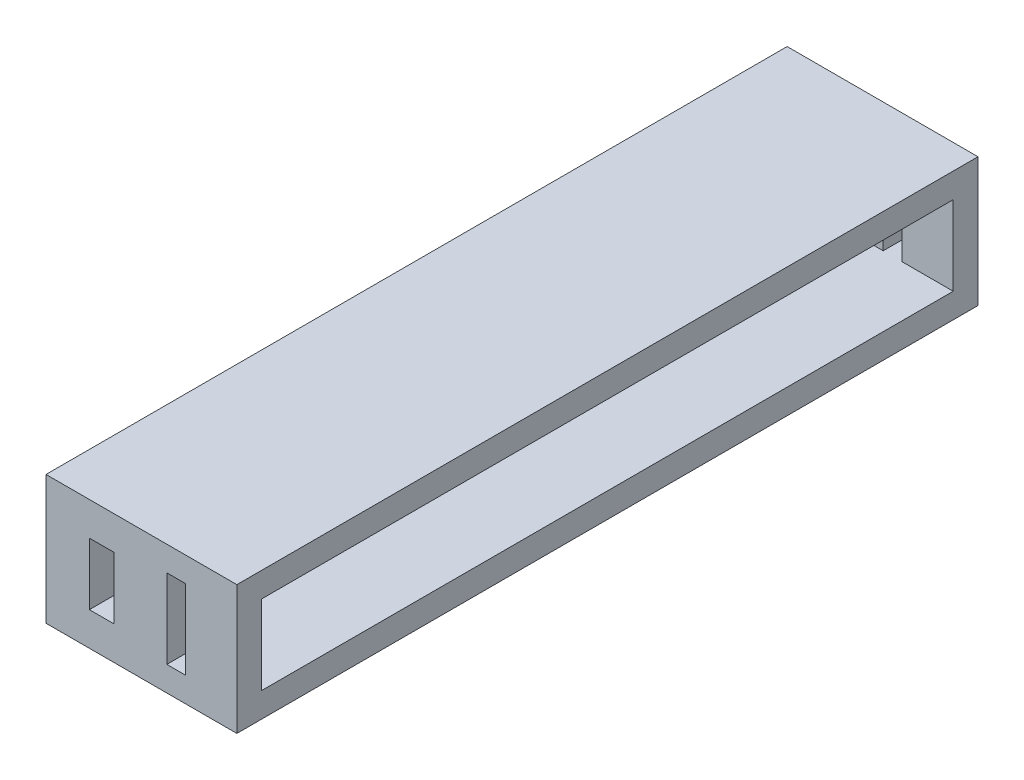
ISO-10303-21;
HEADER;
FILE_DESCRIPTION(('STEP AP214'),'2;1');
FILE_NAME('part.step','',(''),(''),'','','');
FILE_SCHEMA(('AUTOMOTIVE_DESIGN { 1 0 10303 214 1 1 1 1 }'));
ENDSEC;
DATA;
#1=APPLICATION_CONTEXT('core data for automotive mechanical design processes');
#2=APPLICATION_PROTOCOL_DEFINITION('international standard','automotive_design',2000,#1);
#3=PRODUCT_CONTEXT('',#1,'mechanical');
#4=PRODUCT('Part','Part','',(#3));
#5=PRODUCT_RELATED_PRODUCT_CATEGORY('part','',(#4));
#6=PRODUCT_DEFINITION_FORMATION('','',#4);
#7=PRODUCT_DEFINITION_CONTEXT('part definition',#1,'design');
#8=PRODUCT_DEFINITION('design','',#6,#7);
#9=PRODUCT_DEFINITION_SHAPE('','',#8);
#10=(LENGTH_UNIT() NAMED_UNIT(*) SI_UNIT(.MILLI.,.METRE.));
#11=(NAMED_UNIT(*) PLANE_ANGLE_UNIT() SI_UNIT($,.RADIAN.));
#12=(NAMED_UNIT(*) SI_UNIT($,.STERADIAN.) SOLID_ANGLE_UNIT());
#13=UNCERTAINTY_MEASURE_WITH_UNIT(LENGTH_MEASURE(1.E-05),#10,'distance_accuracy_value','');
#14=(GEOMETRIC_REPRESENTATION_CONTEXT(3) GLOBAL_UNCERTAINTY_ASSIGNED_CONTEXT((#13)) GLOBAL_UNIT_ASSIGNED_CONTEXT((#10,
#11,#12)) REPRESENTATION_CONTEXT('',''));
#15=CARTESIAN_POINT('',(0.,0.,0.));
#16=DIRECTION('',(0.,0.,1.));
#17=DIRECTION('',(1.,0.,0.));
#18=AXIS2_PLACEMENT_3D('',#15,#16,#17);
#19=CARTESIAN_POINT('',(13.4,0.,-115.6));
#20=DIRECTION('',(0.,0.,1.));
#21=DIRECTION('',(1.,0.,0.));
#22=AXIS2_PLACEMENT_3D('',#19,#20,#21);
#23=PLANE('',#22);
#24=DIRECTION('',(0.,1.,0.));
#25=VECTOR('',#24,1.);
#26=CARTESIAN_POINT('',(-6.4,1.4,-115.6));
#27=LINE('',#26,#25);
#28=CARTESIAN_POINT('',(-6.4,1.4,-115.6));
#29=VERTEX_POINT('',#28);
#30=CARTESIAN_POINT('',(-6.4,11.4,-115.6));
#31=VERTEX_POINT('',#30);
#32=EDGE_CURVE('E70',#29,#31,#27,.T.);
#33=ORIENTED_EDGE('',*,*,#32,.T.);
#34=DIRECTION('',(-1.,0.,0.));
#35=VECTOR('',#34,1.);
#36=CARTESIAN_POINT('',(-10.4,11.4,-115.6));
#37=LINE('',#36,#35);
#38=CARTESIAN_POINT('',(-10.4,11.4,-115.6));
#39=VERTEX_POINT('',#38);
#40=EDGE_CURVE('E420',#31,#39,#37,.T.);
#41=ORIENTED_EDGE('',*,*,#40,.T.);
#42=DIRECTION('',(0.,-1.,0.));
#43=VECTOR('',#42,1.);
#44=CARTESIAN_POINT('',(-10.4,1.4,-115.6));
#45=LINE('',#44,#43);
#46=CARTESIAN_POINT('',(-10.4,1.4,-115.6));
#47=VERTEX_POINT('',#46);
#48=EDGE_CURVE('E413',#39,#47,#45,.T.);
#49=ORIENTED_EDGE('',*,*,#48,.T.);
#50=DIRECTION('',(1.,0.,0.));
#51=VECTOR('',#50,1.);
#52=CARTESIAN_POINT('',(-10.4,1.4,-115.6));
#53=LINE('',#52,#51);
#54=EDGE_CURVE('E414',#47,#29,#53,.T.);
#55=ORIENTED_EDGE('',*,*,#54,.T.);
#56=EDGE_LOOP('',(#33,#41,#49,#55));
#57=FACE_BOUND('',#56,.T.);
#58=DIRECTION('',(0.,1.,0.));
#59=VECTOR('',#58,1.);
#60=CARTESIAN_POINT('',(-17.4,0.,-115.6));
#61=LINE('',#60,#59);
#62=CARTESIAN_POINT('',(-17.4,-4.,-115.6));
#63=VERTEX_POINT('',#62);
#64=CARTESIAN_POINT('',(-17.4,16.8,-115.6));
#65=VERTEX_POINT('',#64);
#66=EDGE_CURVE('E251',#63,#65,#61,.T.);
#67=ORIENTED_EDGE('',*,*,#66,.T.);
#68=DIRECTION('',(-1.,0.,0.));
#69=VECTOR('',#68,1.);
#70=CARTESIAN_POINT('',(13.4,16.8,-115.6));
#71=LINE('',#70,#69);
#72=CARTESIAN_POINT('',(13.4,16.8,-115.6));
#73=VERTEX_POINT('',#72);
#74=EDGE_CURVE('E255',#73,#65,#71,.T.);
#75=ORIENTED_EDGE('',*,*,#74,.F.);
#76=DIRECTION('',(0.,1.,0.));
#77=VECTOR('',#76,1.);
#78=CARTESIAN_POINT('',(13.4,0.,-115.6));
#79=LINE('',#78,#77);
#80=CARTESIAN_POINT('',(13.4,-4.,-115.6));
#81=VERTEX_POINT('',#80);
#82=EDGE_CURVE('E267',#81,#73,#79,.T.);
#83=ORIENTED_EDGE('',*,*,#82,.F.);
#84=DIRECTION('',(-1.,0.,0.));
#85=VECTOR('',#84,1.);
#86=CARTESIAN_POINT('',(13.4,-4.,-115.6));
#87=LINE('',#86,#85);
#88=EDGE_CURVE('E55',#81,#63,#87,.T.);
#89=ORIENTED_EDGE('',*,*,#88,.T.);
#90=EDGE_LOOP('',(#67,#75,#83,#89));
#91=FACE_BOUND('',#90,.T.);
#92=DIRECTION('',(0.,-1.,0.));
#93=VECTOR('',#92,1.);
#94=CARTESIAN_POINT('',(2.1,12.8,-115.6));
#95=LINE('',#94,#93);
#96=CARTESIAN_POINT('',(2.1,12.8,-115.6));
#97=VERTEX_POINT('',#96);
#98=CARTESIAN_POINT('',(2.1,0.,-115.6));
#99=VERTEX_POINT('',#98);
#100=EDGE_CURVE('E58',#97,#99,#95,.T.);
#101=ORIENTED_EDGE('',*,*,#100,.T.);
#102=DIRECTION('',(1.,0.,0.));
#103=VECTOR('',#102,1.);
#104=CARTESIAN_POINT('',(2.1,0.,-115.6));
#105=LINE('',#104,#103);
#106=CARTESIAN_POINT('',(5.1,0.,-115.6));
#107=VERTEX_POINT('',#106);
#108=EDGE_CURVE('E211',#99,#107,#105,.T.);
#109=ORIENTED_EDGE('',*,*,#108,.T.);
#110=DIRECTION('',(0.,1.,0.));
#111=VECTOR('',#110,1.);
#112=CARTESIAN_POINT('',(5.1,12.8,-115.6));
#113=LINE('',#112,#111);
#114=CARTESIAN_POINT('',(5.1,12.8,-115.6));
#115=VERTEX_POINT('',#114);
#116=EDGE_CURVE('E525',#107,#115,#113,.T.);
#117=ORIENTED_EDGE('',*,*,#116,.T.);
#118=DIRECTION('',(-1.,0.,0.));
#119=VECTOR('',#118,1.);
#120=CARTESIAN_POINT('',(2.1,12.8,-115.6));
#121=LINE('',#120,#119);
#122=EDGE_CURVE('E397',#115,#97,#121,.T.);
#123=ORIENTED_EDGE('',*,*,#122,.T.);
#124=EDGE_LOOP('',(#101,#109,#117,#123));
#125=FACE_BOUND('',#124,.T.);
#126=ADVANCED_FACE('F43',(#57,#91,#125),#23,.F.);
#127=CARTESIAN_POINT('',(13.4,0.,-111.6));
#128=DIRECTION('',(0.,0.,1.));
#129=DIRECTION('',(1.,0.,0.));
#130=AXIS2_PLACEMENT_3D('',#127,#128,#129);
#131=PLANE('',#130);
#132=DIRECTION('',(0.,-1.,0.));
#133=VECTOR('',#132,1.);
#134=CARTESIAN_POINT('',(2.1,12.8,-111.6));
#135=LINE('',#134,#133);
#136=CARTESIAN_POINT('',(2.1,12.8,-111.6));
#137=VERTEX_POINT('',#136);
#138=CARTESIAN_POINT('',(2.1,0.,-111.6));
#139=VERTEX_POINT('',#138);
#140=EDGE_CURVE('E210',#137,#139,#135,.T.);
#141=ORIENTED_EDGE('',*,*,#140,.F.);
#142=DIRECTION('',(-1.,0.,0.));
#143=VECTOR('',#142,1.);
#144=CARTESIAN_POINT('',(13.4,12.8,-111.6));
#145=LINE('',#144,#143);
#146=CARTESIAN_POINT('',(-13.4,12.8,-111.6));
#147=VERTEX_POINT('',#146);
#148=EDGE_CURVE('E218',#137,#147,#145,.T.);
#149=ORIENTED_EDGE('',*,*,#148,.T.);
#150=DIRECTION('',(0.,1.,0.));
#151=VECTOR('',#150,1.);
#152=CARTESIAN_POINT('',(-13.4,0.,-111.6));
#153=LINE('',#152,#151);
#154=CARTESIAN_POINT('',(-13.4,0.,-111.6));
#155=VERTEX_POINT('',#154);
#156=EDGE_CURVE('E515',#155,#147,#153,.T.);
#157=ORIENTED_EDGE('',*,*,#156,.F.);
#158=DIRECTION('',(-1.,0.,0.));
#159=VECTOR('',#158,1.);
#160=CARTESIAN_POINT('',(13.4,0.,-111.6));
#161=LINE('',#160,#159);
#162=EDGE_CURVE('E224',#139,#155,#161,.T.);
#163=ORIENTED_EDGE('',*,*,#162,.F.);
#164=EDGE_LOOP('',(#141,#149,#157,#163));
#165=FACE_BOUND('',#164,.T.);
#166=DIRECTION('',(-1.,0.,0.));
#167=VECTOR('',#166,1.);
#168=CARTESIAN_POINT('',(-10.4,11.4,-111.6));
#169=LINE('',#168,#167);
#170=CARTESIAN_POINT('',(-6.4,11.4,-111.6));
#171=VERTEX_POINT('',#170);
#172=CARTESIAN_POINT('',(-10.4,11.4,-111.6));
#173=VERTEX_POINT('',#172);
#174=EDGE_CURVE('E403',#171,#173,#169,.T.);
#175=ORIENTED_EDGE('',*,*,#174,.F.);
#176=DIRECTION('',(0.,1.,0.));
#177=VECTOR('',#176,1.);
#178=CARTESIAN_POINT('',(-6.4,1.4,-111.6));
#179=LINE('',#178,#177);
#180=CARTESIAN_POINT('',(-6.4,1.4,-111.6));
#181=VERTEX_POINT('',#180);
#182=EDGE_CURVE('E409',#181,#171,#179,.T.);
#183=ORIENTED_EDGE('',*,*,#182,.F.);
#184=DIRECTION('',(1.,0.,0.));
#185=VECTOR('',#184,1.);
#186=CARTESIAN_POINT('',(-10.4,1.4,-111.6));
#187=LINE('',#186,#185);
#188=CARTESIAN_POINT('',(-10.4,1.4,-111.6));
#189=VERTEX_POINT('',#188);
#190=EDGE_CURVE('E389',#189,#181,#187,.T.);
#191=ORIENTED_EDGE('',*,*,#190,.F.);
#192=DIRECTION('',(0.,-1.,0.));
#193=VECTOR('',#192,1.);
#194=CARTESIAN_POINT('',(-10.4,1.4,-111.6));
#195=LINE('',#194,#193);
#196=EDGE_CURVE('E401',#173,#189,#195,.T.);
#197=ORIENTED_EDGE('',*,*,#196,.F.);
#198=EDGE_LOOP('',(#175,#183,#191,#197));
#199=FACE_BOUND('',#198,.T.);
#200=ADVANCED_FACE('F219',(#165,#199),#131,.T.);
#201=DIRECTION('',(0.,1.,0.));
#202=VECTOR('',#201,1.);
#203=CARTESIAN_POINT('',(5.1,12.8,-111.6));
#204=LINE('',#203,#202);
#205=CARTESIAN_POINT('',(5.1,0.,-111.6));
#206=VERTEX_POINT('',#205);
#207=CARTESIAN_POINT('',(5.1,12.8,-111.6));
#208=VERTEX_POINT('',#207);
#209=EDGE_CURVE('E225',#206,#208,#204,.T.);
#210=ORIENTED_EDGE('',*,*,#209,.F.);
#211=CARTESIAN_POINT('',(13.4,0.,-111.6));
#212=VERTEX_POINT('',#211);
#213=EDGE_CURVE('E238',#212,#206,#161,.T.);
#214=ORIENTED_EDGE('',*,*,#213,.F.);
#215=DIRECTION('',(0.,1.,0.));
#216=VECTOR('',#215,1.);
#217=CARTESIAN_POINT('',(13.4,0.,-111.6));
#218=LINE('',#217,#216);
#219=CARTESIAN_POINT('',(13.4,12.8,-111.6));
#220=VERTEX_POINT('',#219);
#221=EDGE_CURVE('E394',#212,#220,#218,.T.);
#222=ORIENTED_EDGE('',*,*,#221,.T.);
#223=EDGE_CURVE('E230',#220,#208,#145,.T.);
#224=ORIENTED_EDGE('',*,*,#223,.T.);
#225=EDGE_LOOP('',(#210,#214,#222,#224));
#226=FACE_BOUND('',#225,.T.);
#227=ADVANCED_FACE('F308',(#226),#131,.T.);
#228=CARTESIAN_POINT('',(13.4,0.,0.));
#229=DIRECTION('',(0.,0.,-1.));
#230=DIRECTION('',(-1.,0.,0.));
#231=AXIS2_PLACEMENT_3D('',#228,#229,#230);
#232=PLANE('',#231);
#233=DIRECTION('',(0.,1.,0.));
#234=VECTOR('',#233,1.);
#235=CARTESIAN_POINT('',(-6.4,1.4,0.));
#236=LINE('',#235,#234);
#237=CARTESIAN_POINT('',(-6.4,1.4,0.));
#238=VERTEX_POINT('',#237);
#239=CARTESIAN_POINT('',(-6.4,11.4,0.));
#240=VERTEX_POINT('',#239);
#241=EDGE_CURVE('E451',#238,#240,#236,.T.);
#242=ORIENTED_EDGE('',*,*,#241,.T.);
#243=DIRECTION('',(-1.,0.,0.));
#244=VECTOR('',#243,1.);
#245=CARTESIAN_POINT('',(-10.4,11.4,0.));
#246=LINE('',#245,#244);
#247=CARTESIAN_POINT('',(-10.4,11.4,0.));
#248=VERTEX_POINT('',#247);
#249=EDGE_CURVE('E472',#240,#248,#246,.T.);
#250=ORIENTED_EDGE('',*,*,#249,.T.);
#251=DIRECTION('',(0.,-1.,0.));
#252=VECTOR('',#251,1.);
#253=CARTESIAN_POINT('',(-10.4,1.4,0.));
#254=LINE('',#253,#252);
#255=CARTESIAN_POINT('',(-10.4,1.4,0.));
#256=VERTEX_POINT('',#255);
#257=EDGE_CURVE('E473',#248,#256,#254,.T.);
#258=ORIENTED_EDGE('',*,*,#257,.T.);
#259=DIRECTION('',(1.,0.,0.));
#260=VECTOR('',#259,1.);
#261=CARTESIAN_POINT('',(-10.4,1.4,0.));
#262=LINE('',#261,#260);
#263=EDGE_CURVE('E466',#256,#238,#262,.T.);
#264=ORIENTED_EDGE('',*,*,#263,.T.);
#265=EDGE_LOOP('',(#242,#250,#258,#264));
#266=FACE_BOUND('',#265,.T.);
#267=DIRECTION('',(-1.,0.,0.));
#268=VECTOR('',#267,1.);
#269=CARTESIAN_POINT('',(13.4,12.8,0.));
#270=LINE('',#269,#268);
#271=CARTESIAN_POINT('',(2.1,12.8,0.));
#272=VERTEX_POINT('',#271);
#273=CARTESIAN_POINT('',(-13.4,12.8,0.));
#274=VERTEX_POINT('',#273);
#275=EDGE_CURVE('E234',#272,#274,#270,.T.);
#276=ORIENTED_EDGE('',*,*,#275,.F.);
#277=DIRECTION('',(0.,-1.,0.));
#278=VECTOR('',#277,1.);
#279=CARTESIAN_POINT('',(2.1,12.8,0.));
#280=LINE('',#279,#278);
#281=CARTESIAN_POINT('',(2.1,0.,0.));
#282=VERTEX_POINT('',#281);
#283=EDGE_CURVE('E448',#272,#282,#280,.T.);
#284=ORIENTED_EDGE('',*,*,#283,.T.);
#285=DIRECTION('',(-1.,0.,0.));
#286=VECTOR('',#285,1.);
#287=CARTESIAN_POINT('',(13.4,0.,0.));
#288=LINE('',#287,#286);
#289=CARTESIAN_POINT('',(-13.4,0.,0.));
#290=VERTEX_POINT('',#289);
#291=EDGE_CURVE('E241',#282,#290,#288,.T.);
#292=ORIENTED_EDGE('',*,*,#291,.T.);
#293=DIRECTION('',(0.,-1.,0.));
#294=VECTOR('',#293,1.);
#295=CARTESIAN_POINT('',(-13.4,0.,0.));
#296=LINE('',#295,#294);
#297=EDGE_CURVE('E499',#274,#290,#296,.T.);
#298=ORIENTED_EDGE('',*,*,#297,.F.);
#299=EDGE_LOOP('',(#276,#284,#292,#298));
#300=FACE_BOUND('',#299,.T.);
#301=ADVANCED_FACE('F316',(#266,#300),#232,.T.);
#302=CARTESIAN_POINT('',(13.4,0.,0.));
#303=VERTEX_POINT('',#302);
#304=CARTESIAN_POINT('',(5.1,0.,0.));
#305=VERTEX_POINT('',#304);
#306=EDGE_CURVE('E245',#303,#305,#288,.T.);
#307=ORIENTED_EDGE('',*,*,#306,.T.);
#308=DIRECTION('',(0.,1.,0.));
#309=VECTOR('',#308,1.);
#310=CARTESIAN_POINT('',(5.1,12.8,0.));
#311=LINE('',#310,#309);
#312=CARTESIAN_POINT('',(5.1,12.8,0.));
#313=VERTEX_POINT('',#312);
#314=EDGE_CURVE('E453',#305,#313,#311,.T.);
#315=ORIENTED_EDGE('',*,*,#314,.T.);
#316=CARTESIAN_POINT('',(13.4,12.8,0.));
#317=VERTEX_POINT('',#316);
#318=EDGE_CURVE('E229',#317,#313,#270,.T.);
#319=ORIENTED_EDGE('',*,*,#318,.F.);
#320=DIRECTION('',(0.,-1.,0.));
#321=VECTOR('',#320,1.);
#322=CARTESIAN_POINT('',(13.4,0.,0.));
#323=LINE('',#322,#321);
#324=EDGE_CURVE('E501',#317,#303,#323,.T.);
#325=ORIENTED_EDGE('',*,*,#324,.T.);
#326=EDGE_LOOP('',(#307,#315,#319,#325));
#327=FACE_BOUND('',#326,.T.);
#328=ADVANCED_FACE('F319',(#327),#232,.T.);
#329=CARTESIAN_POINT('',(13.4,0.,0.));
#330=DIRECTION('',(-1.,0.,0.));
#331=DIRECTION('',(0.,0.,1.));
#332=AXIS2_PLACEMENT_3D('',#329,#330,#331);
#333=PLANE('',#332);
#334=DIRECTION('',(0.,-1.,0.));
#335=VECTOR('',#334,1.);
#336=CARTESIAN_POINT('',(13.4,0.,4.));
#337=LINE('',#336,#335);
#338=CARTESIAN_POINT('',(13.4,16.8,4.));
#339=VERTEX_POINT('',#338);
#340=CARTESIAN_POINT('',(13.4,-4.,4.));
#341=VERTEX_POINT('',#340);
#342=EDGE_CURVE('E264',#339,#341,#337,.T.);
#343=ORIENTED_EDGE('',*,*,#342,.T.);
#344=DIRECTION('',(0.,0.,-1.));
#345=VECTOR('',#344,1.);
#346=CARTESIAN_POINT('',(13.4,-4.,0.));
#347=LINE('',#346,#345);
#348=EDGE_CURVE('E263',#341,#81,#347,.T.);
#349=ORIENTED_EDGE('',*,*,#348,.T.);
#350=ORIENTED_EDGE('',*,*,#82,.T.);
#351=DIRECTION('',(0.,0.,1.));
#352=VECTOR('',#351,1.);
#353=CARTESIAN_POINT('',(13.4,16.8,0.));
#354=LINE('',#353,#352);
#355=EDGE_CURVE('E50',#73,#339,#354,.T.);
#356=ORIENTED_EDGE('',*,*,#355,.T.);
#357=EDGE_LOOP('',(#343,#349,#350,#356));
#358=FACE_BOUND('',#357,.T.);
#359=ORIENTED_EDGE('',*,*,#324,.F.);
#360=DIRECTION('',(0.,0.,1.));
#361=VECTOR('',#360,1.);
#362=CARTESIAN_POINT('',(13.4,12.8,0.));
#363=LINE('',#362,#361);
#364=EDGE_CURVE('E391',#220,#317,#363,.T.);
#365=ORIENTED_EDGE('',*,*,#364,.F.);
#366=ORIENTED_EDGE('',*,*,#221,.F.);
#367=DIRECTION('',(0.,0.,-1.));
#368=VECTOR('',#367,1.);
#369=CARTESIAN_POINT('',(13.4,0.,0.));
#370=LINE('',#369,#368);
#371=EDGE_CURVE('E503',#303,#212,#370,.T.);
#372=ORIENTED_EDGE('',*,*,#371,.F.);
#373=EDGE_LOOP('',(#359,#365,#366,#372));
#374=FACE_BOUND('',#373,.T.);
#375=ADVANCED_FACE('F275',(#358,#374),#333,.F.);
#376=CARTESIAN_POINT('',(13.4,0.,4.));
#377=DIRECTION('',(0.,0.,-1.));
#378=DIRECTION('',(-1.,0.,0.));
#379=AXIS2_PLACEMENT_3D('',#376,#377,#378);
#380=PLANE('',#379);
#381=DIRECTION('',(1.,0.,0.));
#382=VECTOR('',#381,1.);
#383=CARTESIAN_POINT('',(2.1,0.,4.));
#384=LINE('',#383,#382);
#385=CARTESIAN_POINT('',(2.1,0.,4.));
#386=VERTEX_POINT('',#385);
#387=CARTESIAN_POINT('',(5.1,0.,4.));
#388=VERTEX_POINT('',#387);
#389=EDGE_CURVE('E443',#386,#388,#384,.T.);
#390=ORIENTED_EDGE('',*,*,#389,.F.);
#391=DIRECTION('',(0.,-1.,0.));
#392=VECTOR('',#391,1.);
#393=CARTESIAN_POINT('',(2.1,12.8,4.));
#394=LINE('',#393,#392);
#395=CARTESIAN_POINT('',(2.1,12.8,4.));
#396=VERTEX_POINT('',#395);
#397=EDGE_CURVE('E450',#396,#386,#394,.T.);
#398=ORIENTED_EDGE('',*,*,#397,.F.);
#399=DIRECTION('',(-1.,0.,0.));
#400=VECTOR('',#399,1.);
#401=CARTESIAN_POINT('',(2.1,12.8,4.));
#402=LINE('',#401,#400);
#403=CARTESIAN_POINT('',(5.1,12.8,4.));
#404=VERTEX_POINT('',#403);
#405=EDGE_CURVE('E440',#404,#396,#402,.T.);
#406=ORIENTED_EDGE('',*,*,#405,.F.);
#407=DIRECTION('',(0.,1.,0.));
#408=VECTOR('',#407,1.);
#409=CARTESIAN_POINT('',(5.1,12.8,4.));
#410=LINE('',#409,#408);
#411=EDGE_CURVE('E441',#388,#404,#410,.T.);
#412=ORIENTED_EDGE('',*,*,#411,.F.);
#413=EDGE_LOOP('',(#390,#398,#406,#412));
#414=FACE_BOUND('',#413,.T.);
#415=DIRECTION('',(-1.,0.,0.));
#416=VECTOR('',#415,1.);
#417=CARTESIAN_POINT('',(-10.4,11.4,4.));
#418=LINE('',#417,#416);
#419=CARTESIAN_POINT('',(-6.4,11.4,4.));
#420=VERTEX_POINT('',#419);
#421=CARTESIAN_POINT('',(-10.4,11.4,4.));
#422=VERTEX_POINT('',#421);
#423=EDGE_CURVE('E483',#420,#422,#418,.T.);
#424=ORIENTED_EDGE('',*,*,#423,.F.);
#425=DIRECTION('',(0.,1.,0.));
#426=VECTOR('',#425,1.);
#427=CARTESIAN_POINT('',(-6.4,1.4,4.));
#428=LINE('',#427,#426);
#429=CARTESIAN_POINT('',(-6.4,1.4,4.));
#430=VERTEX_POINT('',#429);
#431=EDGE_CURVE('E475',#430,#420,#428,.T.);
#432=ORIENTED_EDGE('',*,*,#431,.F.);
#433=DIRECTION('',(1.,0.,0.));
#434=VECTOR('',#433,1.);
#435=CARTESIAN_POINT('',(-10.4,1.4,4.));
#436=LINE('',#435,#434);
#437=CARTESIAN_POINT('',(-10.4,1.4,4.));
#438=VERTEX_POINT('',#437);
#439=EDGE_CURVE('E433',#438,#430,#436,.T.);
#440=ORIENTED_EDGE('',*,*,#439,.F.);
#441=DIRECTION('',(0.,-1.,0.));
#442=VECTOR('',#441,1.);
#443=CARTESIAN_POINT('',(-10.4,1.4,4.));
#444=LINE('',#443,#442);
#445=EDGE_CURVE('E486',#422,#438,#444,.T.);
#446=ORIENTED_EDGE('',*,*,#445,.F.);
#447=EDGE_LOOP('',(#424,#432,#440,#446));
#448=FACE_BOUND('',#447,.T.);
#449=DIRECTION('',(0.,-1.,0.));
#450=VECTOR('',#449,1.);
#451=CARTESIAN_POINT('',(-17.4,0.,4.));
#452=LINE('',#451,#450);
#453=CARTESIAN_POINT('',(-17.4,16.8,4.));
#454=VERTEX_POINT('',#453);
#455=CARTESIAN_POINT('',(-17.4,-4.,4.));
#456=VERTEX_POINT('',#455);
#457=EDGE_CURVE('E244',#454,#456,#452,.T.);
#458=ORIENTED_EDGE('',*,*,#457,.T.);
#459=DIRECTION('',(-1.,0.,0.));
#460=VECTOR('',#459,1.);
#461=CARTESIAN_POINT('',(13.4,-4.,4.));
#462=LINE('',#461,#460);
#463=EDGE_CURVE('E12',#341,#456,#462,.T.);
#464=ORIENTED_EDGE('',*,*,#463,.F.);
#465=ORIENTED_EDGE('',*,*,#342,.F.);
#466=DIRECTION('',(-1.,0.,0.));
#467=VECTOR('',#466,1.);
#468=CARTESIAN_POINT('',(13.4,16.8,4.));
#469=LINE('',#468,#467);
#470=EDGE_CURVE('E248',#339,#454,#469,.T.);
#471=ORIENTED_EDGE('',*,*,#470,.T.);
#472=EDGE_LOOP('',(#458,#464,#465,#471));
#473=FACE_BOUND('',#472,.T.);
#474=ADVANCED_FACE('F282',(#414,#448,#473),#380,.F.);
#475=CARTESIAN_POINT('',(13.4,-4.,0.));
#476=DIRECTION('',(0.,1.,0.));
#477=DIRECTION('',(0.,0.,1.));
#478=AXIS2_PLACEMENT_3D('',#475,#476,#477);
#479=PLANE('',#478);
#480=DIRECTION('',(0.,0.,-1.));
#481=VECTOR('',#480,1.);
#482=CARTESIAN_POINT('',(-17.4,-4.,0.));
#483=LINE('',#482,#481);
#484=EDGE_CURVE('E250',#456,#63,#483,.T.);
#485=ORIENTED_EDGE('',*,*,#484,.T.);
#486=ORIENTED_EDGE('',*,*,#88,.F.);
#487=ORIENTED_EDGE('',*,*,#348,.F.);
#488=ORIENTED_EDGE('',*,*,#463,.T.);
#489=EDGE_LOOP('',(#485,#486,#487,#488));
#490=FACE_BOUND('',#489,.T.);
#491=ADVANCED_FACE('F285',(#490),#479,.F.);
#492=CARTESIAN_POINT('',(13.4,16.8,0.));
#493=DIRECTION('',(0.,-1.,0.));
#494=DIRECTION('',(0.,0.,-1.));
#495=AXIS2_PLACEMENT_3D('',#492,#493,#494);
#496=PLANE('',#495);
#497=DIRECTION('',(0.,0.,1.));
#498=VECTOR('',#497,1.);
#499=CARTESIAN_POINT('',(-17.4,16.8,0.));
#500=LINE('',#499,#498);
#501=EDGE_CURVE('E259',#65,#454,#500,.T.);
#502=ORIENTED_EDGE('',*,*,#501,.T.);
#503=ORIENTED_EDGE('',*,*,#470,.F.);
#504=ORIENTED_EDGE('',*,*,#355,.F.);
#505=ORIENTED_EDGE('',*,*,#74,.T.);
#506=EDGE_LOOP('',(#502,#503,#504,#505));
#507=FACE_BOUND('',#506,.T.);
#508=ADVANCED_FACE('F280',(#507),#496,.F.);
#509=CARTESIAN_POINT('',(-17.4,0.,0.));
#510=DIRECTION('',(-1.,0.,0.));
#511=DIRECTION('',(0.,0.,1.));
#512=AXIS2_PLACEMENT_3D('',#509,#510,#511);
#513=PLANE('',#512);
#514=CARTESIAN_POINT('',(-17.4,6.4,-105.8));
#515=DIRECTION('',(1.,0.,0.));
#516=DIRECTION('',(0.,0.,-1.));
#517=AXIS2_PLACEMENT_3D('',#514,#515,#516);
#518=CIRCLE('',#517,2.5);
#519=CARTESIAN_POINT('',(-17.4,6.4,-103.3));
#520=VERTEX_POINT('',#519);
#521=EDGE_CURVE('E431',#520,#520,#518,.T.);
#522=ORIENTED_EDGE('',*,*,#521,.T.);
#523=EDGE_LOOP('',(#522));
#524=FACE_BOUND('',#523,.T.);
#525=CARTESIAN_POINT('',(-17.4,6.4,-5.8));
#526=DIRECTION('',(-1.,0.,0.));
#527=DIRECTION('',(0.,0.,1.));
#528=AXIS2_PLACEMENT_3D('',#525,#526,#527);
#529=CIRCLE('',#528,2.5);
#530=CARTESIAN_POINT('',(-17.4,6.4,-3.3));
#531=VERTEX_POINT('',#530);
#532=EDGE_CURVE('E439',#531,#531,#529,.T.);
#533=ORIENTED_EDGE('',*,*,#532,.F.);
#534=EDGE_LOOP('',(#533));
#535=FACE_BOUND('',#534,.T.);
#536=ORIENTED_EDGE('',*,*,#457,.F.);
#537=ORIENTED_EDGE('',*,*,#501,.F.);
#538=ORIENTED_EDGE('',*,*,#66,.F.);
#539=ORIENTED_EDGE('',*,*,#484,.F.);
#540=EDGE_LOOP('',(#536,#537,#538,#539));
#541=FACE_BOUND('',#540,.T.);
#542=ADVANCED_FACE('F44',(#524,#535,#541),#513,.T.);
#543=CARTESIAN_POINT('',(13.4,0.,0.));
#544=DIRECTION('',(0.,1.,0.));
#545=DIRECTION('',(0.,0.,1.));
#546=AXIS2_PLACEMENT_3D('',#543,#544,#545);
#547=PLANE('',#546);
#548=DIRECTION('',(0.,0.,-1.));
#549=VECTOR('',#548,1.);
#550=CARTESIAN_POINT('',(-13.4,0.,0.));
#551=LINE('',#550,#549);
#552=EDGE_CURVE('E508',#290,#155,#551,.T.);
#553=ORIENTED_EDGE('',*,*,#552,.F.);
#554=ORIENTED_EDGE('',*,*,#291,.F.);
#555=DIRECTION('',(0.,0.,1.));
#556=VECTOR('',#555,1.);
#557=CARTESIAN_POINT('',(2.1,0.,-115.601));
#558=LINE('',#557,#556);
#559=EDGE_CURVE('E454',#282,#386,#558,.T.);
#560=ORIENTED_EDGE('',*,*,#559,.T.);
#561=ORIENTED_EDGE('',*,*,#389,.T.);
#562=DIRECTION('',(0.,0.,1.));
#563=VECTOR('',#562,1.);
#564=CARTESIAN_POINT('',(5.1,0.,-115.601));
#565=LINE('',#564,#563);
#566=EDGE_CURVE('E446',#305,#388,#565,.T.);
#567=ORIENTED_EDGE('',*,*,#566,.F.);
#568=ORIENTED_EDGE('',*,*,#306,.F.);
#569=ORIENTED_EDGE('',*,*,#371,.T.);
#570=ORIENTED_EDGE('',*,*,#213,.T.);
#571=DIRECTION('',(0.,0.,-1.));
#572=VECTOR('',#571,1.);
#573=CARTESIAN_POINT('',(5.1,0.,4.001));
#574=LINE('',#573,#572);
#575=EDGE_CURVE('E383',#206,#107,#574,.T.);
#576=ORIENTED_EDGE('',*,*,#575,.T.);
#577=ORIENTED_EDGE('',*,*,#108,.F.);
#578=DIRECTION('',(0.,0.,-1.));
#579=VECTOR('',#578,1.);
#580=CARTESIAN_POINT('',(2.1,0.,4.001));
#581=LINE('',#580,#579);
#582=EDGE_CURVE('E396',#139,#99,#581,.T.);
#583=ORIENTED_EDGE('',*,*,#582,.F.);
#584=ORIENTED_EDGE('',*,*,#162,.T.);
#585=EDGE_LOOP('',(#553,#554,#560,#561,#567,#568,#569,#570,#576,#577,#583,#584));
#586=FACE_BOUND('',#585,.T.);
#587=ADVANCED_FACE('F288',(#586),#547,.T.);
#588=CARTESIAN_POINT('',(13.4,12.8,0.));
#589=DIRECTION('',(0.,-1.,0.));
#590=DIRECTION('',(0.,0.,-1.));
#591=AXIS2_PLACEMENT_3D('',#588,#589,#590);
#592=PLANE('',#591);
#593=DIRECTION('',(0.,0.,1.));
#594=VECTOR('',#593,1.);
#595=CARTESIAN_POINT('',(-13.4,12.8,0.));
#596=LINE('',#595,#594);
#597=EDGE_CURVE('E226',#147,#274,#596,.T.);
#598=ORIENTED_EDGE('',*,*,#597,.F.);
#599=ORIENTED_EDGE('',*,*,#148,.F.);
#600=DIRECTION('',(0.,0.,-1.));
#601=VECTOR('',#600,1.);
#602=CARTESIAN_POINT('',(2.1,12.8,4.001));
#603=LINE('',#602,#601);
#604=EDGE_CURVE('E201',#137,#97,#603,.T.);
#605=ORIENTED_EDGE('',*,*,#604,.T.);
#606=ORIENTED_EDGE('',*,*,#122,.F.);
#607=DIRECTION('',(0.,0.,-1.));
#608=VECTOR('',#607,1.);
#609=CARTESIAN_POINT('',(5.1,12.8,4.001));
#610=LINE('',#609,#608);
#611=EDGE_CURVE('E214',#208,#115,#610,.T.);
#612=ORIENTED_EDGE('',*,*,#611,.F.);
#613=ORIENTED_EDGE('',*,*,#223,.F.);
#614=ORIENTED_EDGE('',*,*,#364,.T.);
#615=ORIENTED_EDGE('',*,*,#318,.T.);
#616=DIRECTION('',(0.,0.,1.));
#617=VECTOR('',#616,1.);
#618=CARTESIAN_POINT('',(5.1,12.8,-115.601));
#619=LINE('',#618,#617);
#620=EDGE_CURVE('E460',#313,#404,#619,.T.);
#621=ORIENTED_EDGE('',*,*,#620,.T.);
#622=ORIENTED_EDGE('',*,*,#405,.T.);
#623=DIRECTION('',(0.,0.,1.));
#624=VECTOR('',#623,1.);
#625=CARTESIAN_POINT('',(2.1,12.8,-115.601));
#626=LINE('',#625,#624);
#627=EDGE_CURVE('E456',#272,#396,#626,.T.);
#628=ORIENTED_EDGE('',*,*,#627,.F.);
#629=ORIENTED_EDGE('',*,*,#275,.T.);
#630=EDGE_LOOP('',(#598,#599,#605,#606,#612,#613,#614,#615,#621,#622,#628,#629));
#631=FACE_BOUND('',#630,.T.);
#632=ADVANCED_FACE('F228',(#631),#592,.T.);
#633=CARTESIAN_POINT('',(-13.4,0.,0.));
#634=DIRECTION('',(-1.,0.,0.));
#635=DIRECTION('',(0.,0.,1.));
#636=AXIS2_PLACEMENT_3D('',#633,#634,#635);
#637=PLANE('',#636);
#638=CARTESIAN_POINT('',(-13.4,6.4,-105.8));
#639=DIRECTION('',(-1.,0.,0.));
#640=DIRECTION('',(0.,0.,1.));
#641=AXIS2_PLACEMENT_3D('',#638,#639,#640);
#642=CIRCLE('',#641,2.5);
#643=CARTESIAN_POINT('',(-13.4,6.4,-103.3));
#644=VERTEX_POINT('',#643);
#645=EDGE_CURVE('E432',#644,#644,#642,.T.);
#646=ORIENTED_EDGE('',*,*,#645,.T.);
#647=EDGE_LOOP('',(#646));
#648=FACE_BOUND('',#647,.T.);
#649=CARTESIAN_POINT('',(-13.4,6.4,-5.8));
#650=DIRECTION('',(-1.,0.,0.));
#651=DIRECTION('',(0.,0.,1.));
#652=AXIS2_PLACEMENT_3D('',#649,#650,#651);
#653=CIRCLE('',#652,2.5);
#654=CARTESIAN_POINT('',(-13.4,6.4,-3.3));
#655=VERTEX_POINT('',#654);
#656=EDGE_CURVE('E500',#655,#655,#653,.F.);
#657=ORIENTED_EDGE('',*,*,#656,.F.);
#658=EDGE_LOOP('',(#657));
#659=FACE_BOUND('',#658,.T.);
#660=ORIENTED_EDGE('',*,*,#297,.T.);
#661=ORIENTED_EDGE('',*,*,#552,.T.);
#662=ORIENTED_EDGE('',*,*,#156,.T.);
#663=ORIENTED_EDGE('',*,*,#597,.T.);
#664=EDGE_LOOP('',(#660,#661,#662,#663));
#665=FACE_BOUND('',#664,.T.);
#666=ADVANCED_FACE('F323',(#648,#659,#665),#637,.F.);
#667=CARTESIAN_POINT('',(13.401,6.4,-5.8));
#668=DIRECTION('',(-1.,0.,0.));
#669=DIRECTION('',(0.,0.,1.));
#670=AXIS2_PLACEMENT_3D('',#667,#668,#669);
#671=CYLINDRICAL_SURFACE('',#670,2.5);
#672=CARTESIAN_POINT('',(-17.4,6.4,-3.3));
#673=CARTESIAN_POINT('',(-17.3583333333333,6.4,-3.3));
#674=CARTESIAN_POINT('',(-17.3166666666667,6.4,-3.3));
#675=CARTESIAN_POINT('',(-17.2333333333333,6.4,-3.3));
#676=CARTESIAN_POINT('',(-17.1916666666667,6.4,-3.3));
#677=CARTESIAN_POINT('',(-17.1083333333333,6.4,-3.3));
#678=CARTESIAN_POINT('',(-17.0666666666667,6.4,-3.3));
#679=CARTESIAN_POINT('',(-16.9833333333333,6.4,-3.3));
#680=CARTESIAN_POINT('',(-16.9416666666667,6.4,-3.3));
#681=CARTESIAN_POINT('',(-16.8583333333333,6.4,-3.3));
#682=CARTESIAN_POINT('',(-16.8166666666667,6.4,-3.3));
#683=CARTESIAN_POINT('',(-16.7333333333333,6.4,-3.3));
#684=CARTESIAN_POINT('',(-16.6916666666667,6.4,-3.3));
#685=CARTESIAN_POINT('',(-16.6083333333333,6.4,-3.3));
#686=CARTESIAN_POINT('',(-16.5666666666667,6.4,-3.3));
#687=CARTESIAN_POINT('',(-16.4833333333333,6.4,-3.3));
#688=CARTESIAN_POINT('',(-16.4416666666667,6.4,-3.3));
#689=CARTESIAN_POINT('',(-16.3583333333333,6.4,-3.3));
#690=CARTESIAN_POINT('',(-16.3166666666667,6.4,-3.3));
#691=CARTESIAN_POINT('',(-16.2333333333333,6.4,-3.3));
#692=CARTESIAN_POINT('',(-16.1916666666667,6.4,-3.3));
#693=CARTESIAN_POINT('',(-16.1083333333333,6.4,-3.3));
#694=CARTESIAN_POINT('',(-16.0666666666667,6.4,-3.3));
#695=CARTESIAN_POINT('',(-15.9833333333333,6.4,-3.3));
#696=CARTESIAN_POINT('',(-15.9416666666667,6.4,-3.3));
#697=CARTESIAN_POINT('',(-15.8583333333333,6.4,-3.3));
#698=CARTESIAN_POINT('',(-15.8166666666667,6.4,-3.3));
#699=CARTESIAN_POINT('',(-15.7333333333333,6.4,-3.3));
#700=CARTESIAN_POINT('',(-15.6916666666667,6.4,-3.3));
#701=CARTESIAN_POINT('',(-15.6083333333333,6.4,-3.3));
#702=CARTESIAN_POINT('',(-15.5666666666667,6.4,-3.3));
#703=CARTESIAN_POINT('',(-15.4833333333333,6.4,-3.3));
#704=CARTESIAN_POINT('',(-15.4416666666667,6.4,-3.3));
#705=CARTESIAN_POINT('',(-15.3583333333333,6.4,-3.3));
#706=CARTESIAN_POINT('',(-15.3166666666667,6.4,-3.3));
#707=CARTESIAN_POINT('',(-15.2333333333333,6.4,-3.3));
#708=CARTESIAN_POINT('',(-15.1916666666667,6.4,-3.3));
#709=CARTESIAN_POINT('',(-15.1083333333333,6.4,-3.3));
#710=CARTESIAN_POINT('',(-15.0666666666667,6.4,-3.3));
#711=CARTESIAN_POINT('',(-14.9833333333333,6.4,-3.3));
#712=CARTESIAN_POINT('',(-14.9416666666667,6.4,-3.3));
#713=CARTESIAN_POINT('',(-14.8583333333333,6.4,-3.3));
#714=CARTESIAN_POINT('',(-14.8166666666667,6.4,-3.3));
#715=CARTESIAN_POINT('',(-14.7333333333333,6.4,-3.3));
#716=CARTESIAN_POINT('',(-14.6916666666667,6.4,-3.3));
#717=CARTESIAN_POINT('',(-14.6083333333333,6.4,-3.3));
#718=CARTESIAN_POINT('',(-14.5666666666667,6.4,-3.3));
#719=CARTESIAN_POINT('',(-14.4833333333333,6.4,-3.3));
#720=CARTESIAN_POINT('',(-14.4416666666667,6.4,-3.3));
#721=CARTESIAN_POINT('',(-14.3583333333333,6.4,-3.3));
#722=CARTESIAN_POINT('',(-14.3166666666667,6.4,-3.3));
#723=CARTESIAN_POINT('',(-14.2333333333333,6.4,-3.3));
#724=CARTESIAN_POINT('',(-14.1916666666667,6.4,-3.3));
#725=CARTESIAN_POINT('',(-14.1083333333333,6.4,-3.3));
#726=CARTESIAN_POINT('',(-14.0666666666667,6.4,-3.3));
#727=CARTESIAN_POINT('',(-13.9833333333333,6.4,-3.3));
#728=CARTESIAN_POINT('',(-13.9416666666667,6.4,-3.3));
#729=CARTESIAN_POINT('',(-13.8583333333333,6.4,-3.3));
#730=CARTESIAN_POINT('',(-13.8166666666667,6.4,-3.3));
#731=CARTESIAN_POINT('',(-13.7333333333333,6.4,-3.3));
#732=CARTESIAN_POINT('',(-13.6916666666667,6.4,-3.3));
#733=CARTESIAN_POINT('',(-13.6083333333333,6.4,-3.3));
#734=CARTESIAN_POINT('',(-13.5666666666667,6.4,-3.3));
#735=CARTESIAN_POINT('',(-13.4833333333333,6.4,-3.3));
#736=CARTESIAN_POINT('',(-13.4416666666667,6.4,-3.3));
#737=CARTESIAN_POINT('',(-13.4,6.4,-3.3));
#738=B_SPLINE_CURVE_WITH_KNOTS('',3,(#672,#673,#674,#675,#676,#677,#678,#679,#680,#681,#682,
#683,#684,#685,#686,#687,#688,#689,#690,#691,#692,#693,#694,#695,#696,#697,#698,#699,#700,#701,
#702,#703,#704,#705,#706,#707,#708,#709,#710,#711,#712,#713,#714,#715,#716,#717,#718,#719,#720,
#721,#722,#723,#724,#725,#726,#727,#728,#729,#730,#731,#732,#733,#734,#735,#736,#737),
.UNSPECIFIED.,.F.,.F.,(4,2,2,2,2,2,2,2,2,2,2,2,2,2,2,2,2,2,2,2,2,2,2,2,2,2,2,2,2,2,2,2,4),(0.,
0.125,0.25,0.375,0.5,0.625000000000001,0.750000000000001,0.875000000000001,1.,1.125,1.25,1.375,
1.5,1.625,1.75,1.875,2.,2.125,2.25,2.375,2.5,2.625,2.75,2.875,3.,3.125,3.25,3.375,3.5,3.625,
3.75,3.875,4.),.UNSPECIFIED.);
#739=EDGE_CURVE('BSEAM330',#531,#655,#738,.T.);
#740=ORIENTED_EDGE('',*,*,#532,.T.);
#741=ORIENTED_EDGE('',*,*,#656,.T.);
#742=ORIENTED_EDGE('',*,*,#739,.T.);
#743=ORIENTED_EDGE('',*,*,#739,.F.);
#744=EDGE_LOOP('',(#740,#742,#741,#743));
#745=FACE_BOUND('',#744,.T.);
#746=ADVANCED_FACE('F330',(#745),#671,.F.);
#747=CARTESIAN_POINT('',(-6.4,1.4,-115.601));
#748=DIRECTION('',(1.,0.,0.));
#749=DIRECTION('',(0.,0.,-1.));
#750=AXIS2_PLACEMENT_3D('',#747,#748,#749);
#751=PLANE('',#750);
#752=DIRECTION('',(0.,0.,1.));
#753=VECTOR('',#752,1.);
#754=CARTESIAN_POINT('',(-6.4,1.4,-115.601));
#755=LINE('',#754,#753);
#756=EDGE_CURVE('E477',#238,#430,#755,.T.);
#757=ORIENTED_EDGE('',*,*,#756,.T.);
#758=ORIENTED_EDGE('',*,*,#431,.T.);
#759=DIRECTION('',(0.,0.,1.));
#760=VECTOR('',#759,1.);
#761=CARTESIAN_POINT('',(-6.4,11.4,-115.601));
#762=LINE('',#761,#760);
#763=EDGE_CURVE('E463',#240,#420,#762,.T.);
#764=ORIENTED_EDGE('',*,*,#763,.F.);
#765=ORIENTED_EDGE('',*,*,#241,.F.);
#766=EDGE_LOOP('',(#757,#758,#764,#765));
#767=FACE_BOUND('',#766,.T.);
#768=ADVANCED_FACE('F334',(#767),#751,.F.);
#769=CARTESIAN_POINT('',(-10.4,1.4,-115.601));
#770=DIRECTION('',(0.,-1.,0.));
#771=DIRECTION('',(0.,0.,-1.));
#772=AXIS2_PLACEMENT_3D('',#769,#770,#771);
#773=PLANE('',#772);
#774=DIRECTION('',(0.,0.,1.));
#775=VECTOR('',#774,1.);
#776=CARTESIAN_POINT('',(-10.4,1.4,-115.601));
#777=LINE('',#776,#775);
#778=EDGE_CURVE('E474',#256,#438,#777,.T.);
#779=ORIENTED_EDGE('',*,*,#778,.T.);
#780=ORIENTED_EDGE('',*,*,#439,.T.);
#781=ORIENTED_EDGE('',*,*,#756,.F.);
#782=ORIENTED_EDGE('',*,*,#263,.F.);
#783=EDGE_LOOP('',(#779,#780,#781,#782));
#784=FACE_BOUND('',#783,.T.);
#785=ADVANCED_FACE('F345',(#784),#773,.F.);
#786=CARTESIAN_POINT('',(-10.4,1.4,-115.601));
#787=DIRECTION('',(-1.,0.,0.));
#788=DIRECTION('',(0.,-1.,0.));
#789=AXIS2_PLACEMENT_3D('',#786,#787,#788);
#790=PLANE('',#789);
#791=DIRECTION('',(0.,0.,1.));
#792=VECTOR('',#791,1.);
#793=CARTESIAN_POINT('',(-10.4,11.4,-115.601));
#794=LINE('',#793,#792);
#795=EDGE_CURVE('E469',#248,#422,#794,.T.);
#796=ORIENTED_EDGE('',*,*,#795,.T.);
#797=ORIENTED_EDGE('',*,*,#445,.T.);
#798=ORIENTED_EDGE('',*,*,#778,.F.);
#799=ORIENTED_EDGE('',*,*,#257,.F.);
#800=EDGE_LOOP('',(#796,#797,#798,#799));
#801=FACE_BOUND('',#800,.T.);
#802=ADVANCED_FACE('F336',(#801),#790,.F.);
#803=CARTESIAN_POINT('',(-10.4,11.4,-115.601));
#804=DIRECTION('',(0.,1.,0.));
#805=DIRECTION('',(0.,0.,1.));
#806=AXIS2_PLACEMENT_3D('',#803,#804,#805);
#807=PLANE('',#806);
#808=ORIENTED_EDGE('',*,*,#763,.T.);
#809=ORIENTED_EDGE('',*,*,#423,.T.);
#810=ORIENTED_EDGE('',*,*,#795,.F.);
#811=ORIENTED_EDGE('',*,*,#249,.F.);
#812=EDGE_LOOP('',(#808,#809,#810,#811));
#813=FACE_BOUND('',#812,.T.);
#814=ADVANCED_FACE('F331',(#813),#807,.F.);
#815=CARTESIAN_POINT('',(2.1,12.8,-115.601));
#816=DIRECTION('',(-1.,0.,0.));
#817=DIRECTION('',(0.,0.,1.));
#818=AXIS2_PLACEMENT_3D('',#815,#816,#817);
#819=PLANE('',#818);
#820=ORIENTED_EDGE('',*,*,#627,.T.);
#821=ORIENTED_EDGE('',*,*,#397,.T.);
#822=ORIENTED_EDGE('',*,*,#559,.F.);
#823=ORIENTED_EDGE('',*,*,#283,.F.);
#824=EDGE_LOOP('',(#820,#821,#822,#823));
#825=FACE_BOUND('',#824,.T.);
#826=ADVANCED_FACE('F340',(#825),#819,.F.);
#827=CARTESIAN_POINT('',(5.1,12.8,-115.601));
#828=DIRECTION('',(1.,0.,0.));
#829=DIRECTION('',(0.,0.,-1.));
#830=AXIS2_PLACEMENT_3D('',#827,#828,#829);
#831=PLANE('',#830);
#832=ORIENTED_EDGE('',*,*,#566,.T.);
#833=ORIENTED_EDGE('',*,*,#411,.T.);
#834=ORIENTED_EDGE('',*,*,#620,.F.);
#835=ORIENTED_EDGE('',*,*,#314,.F.);
#836=EDGE_LOOP('',(#832,#833,#834,#835));
#837=FACE_BOUND('',#836,.T.);
#838=ADVANCED_FACE('F354',(#837),#831,.F.);
#839=CARTESIAN_POINT('',(13.401,6.4,-105.8));
#840=DIRECTION('',(-1.,0.,0.));
#841=DIRECTION('',(0.,0.,1.));
#842=AXIS2_PLACEMENT_3D('',#839,#840,#841);
#843=CYLINDRICAL_SURFACE('',#842,2.5);
#844=CARTESIAN_POINT('',(-17.4,6.4,-103.3));
#845=CARTESIAN_POINT('',(-17.3583333333333,6.4,-103.3));
#846=CARTESIAN_POINT('',(-17.3166666666667,6.4,-103.3));
#847=CARTESIAN_POINT('',(-17.2333333333333,6.4,-103.3));
#848=CARTESIAN_POINT('',(-17.1916666666667,6.4,-103.3));
#849=CARTESIAN_POINT('',(-17.1083333333333,6.4,-103.3));
#850=CARTESIAN_POINT('',(-17.0666666666667,6.4,-103.3));
#851=CARTESIAN_POINT('',(-16.9833333333333,6.4,-103.3));
#852=CARTESIAN_POINT('',(-16.9416666666667,6.4,-103.3));
#853=CARTESIAN_POINT('',(-16.8583333333333,6.4,-103.3));
#854=CARTESIAN_POINT('',(-16.8166666666667,6.4,-103.3));
#855=CARTESIAN_POINT('',(-16.7333333333333,6.4,-103.3));
#856=CARTESIAN_POINT('',(-16.6916666666667,6.4,-103.3));
#857=CARTESIAN_POINT('',(-16.6083333333333,6.4,-103.3));
#858=CARTESIAN_POINT('',(-16.5666666666667,6.4,-103.3));
#859=CARTESIAN_POINT('',(-16.4833333333333,6.4,-103.3));
#860=CARTESIAN_POINT('',(-16.4416666666667,6.4,-103.3));
#861=CARTESIAN_POINT('',(-16.3583333333333,6.4,-103.3));
#862=CARTESIAN_POINT('',(-16.3166666666667,6.4,-103.3));
#863=CARTESIAN_POINT('',(-16.2333333333333,6.4,-103.3));
#864=CARTESIAN_POINT('',(-16.1916666666667,6.4,-103.3));
#865=CARTESIAN_POINT('',(-16.1083333333333,6.4,-103.3));
#866=CARTESIAN_POINT('',(-16.0666666666667,6.4,-103.3));
#867=CARTESIAN_POINT('',(-15.9833333333333,6.4,-103.3));
#868=CARTESIAN_POINT('',(-15.9416666666667,6.4,-103.3));
#869=CARTESIAN_POINT('',(-15.8583333333333,6.4,-103.3));
#870=CARTESIAN_POINT('',(-15.8166666666667,6.4,-103.3));
#871=CARTESIAN_POINT('',(-15.7333333333333,6.4,-103.3));
#872=CARTESIAN_POINT('',(-15.6916666666667,6.4,-103.3));
#873=CARTESIAN_POINT('',(-15.6083333333333,6.4,-103.3));
#874=CARTESIAN_POINT('',(-15.5666666666667,6.4,-103.3));
#875=CARTESIAN_POINT('',(-15.4833333333333,6.4,-103.3));
#876=CARTESIAN_POINT('',(-15.4416666666667,6.4,-103.3));
#877=CARTESIAN_POINT('',(-15.3583333333333,6.4,-103.3));
#878=CARTESIAN_POINT('',(-15.3166666666667,6.4,-103.3));
#879=CARTESIAN_POINT('',(-15.2333333333333,6.4,-103.3));
#880=CARTESIAN_POINT('',(-15.1916666666667,6.4,-103.3));
#881=CARTESIAN_POINT('',(-15.1083333333333,6.4,-103.3));
#882=CARTESIAN_POINT('',(-15.0666666666667,6.4,-103.3));
#883=CARTESIAN_POINT('',(-14.9833333333333,6.4,-103.3));
#884=CARTESIAN_POINT('',(-14.9416666666667,6.4,-103.3));
#885=CARTESIAN_POINT('',(-14.8583333333333,6.4,-103.3));
#886=CARTESIAN_POINT('',(-14.8166666666667,6.4,-103.3));
#887=CARTESIAN_POINT('',(-14.7333333333333,6.4,-103.3));
#888=CARTESIAN_POINT('',(-14.6916666666667,6.4,-103.3));
#889=CARTESIAN_POINT('',(-14.6083333333333,6.4,-103.3));
#890=CARTESIAN_POINT('',(-14.5666666666667,6.4,-103.3));
#891=CARTESIAN_POINT('',(-14.4833333333333,6.4,-103.3));
#892=CARTESIAN_POINT('',(-14.4416666666667,6.4,-103.3));
#893=CARTESIAN_POINT('',(-14.3583333333333,6.4,-103.3));
#894=CARTESIAN_POINT('',(-14.3166666666667,6.4,-103.3));
#895=CARTESIAN_POINT('',(-14.2333333333333,6.4,-103.3));
#896=CARTESIAN_POINT('',(-14.1916666666667,6.4,-103.3));
#897=CARTESIAN_POINT('',(-14.1083333333333,6.4,-103.3));
#898=CARTESIAN_POINT('',(-14.0666666666667,6.4,-103.3));
#899=CARTESIAN_POINT('',(-13.9833333333333,6.4,-103.3));
#900=CARTESIAN_POINT('',(-13.9416666666667,6.4,-103.3));
#901=CARTESIAN_POINT('',(-13.8583333333333,6.4,-103.3));
#902=CARTESIAN_POINT('',(-13.8166666666667,6.4,-103.3));
#903=CARTESIAN_POINT('',(-13.7333333333333,6.4,-103.3));
#904=CARTESIAN_POINT('',(-13.6916666666667,6.4,-103.3));
#905=CARTESIAN_POINT('',(-13.6083333333333,6.4,-103.3));
#906=CARTESIAN_POINT('',(-13.5666666666667,6.4,-103.3));
#907=CARTESIAN_POINT('',(-13.4833333333333,6.4,-103.3));
#908=CARTESIAN_POINT('',(-13.4416666666667,6.4,-103.3));
#909=CARTESIAN_POINT('',(-13.4,6.4,-103.3));
#910=B_SPLINE_CURVE_WITH_KNOTS('',3,(#844,#845,#846,#847,#848,#849,#850,#851,#852,#853,#854,
#855,#856,#857,#858,#859,#860,#861,#862,#863,#864,#865,#866,#867,#868,#869,#870,#871,#872,#873,
#874,#875,#876,#877,#878,#879,#880,#881,#882,#883,#884,#885,#886,#887,#888,#889,#890,#891,#892,
#893,#894,#895,#896,#897,#898,#899,#900,#901,#902,#903,#904,#905,#906,#907,#908,#909),
.UNSPECIFIED.,.F.,.F.,(4,2,2,2,2,2,2,2,2,2,2,2,2,2,2,2,2,2,2,2,2,2,2,2,2,2,2,2,2,2,2,2,4),(0.,
0.125,0.25,0.375,0.5,0.625000000000001,0.750000000000001,0.875000000000001,1.,1.125,1.25,1.375,
1.5,1.625,1.75,1.875,2.,2.125,2.25,2.375,2.5,2.625,2.75,2.875,3.,3.125,3.25,3.375,3.5,3.625,
3.75,3.875,4.),.UNSPECIFIED.);
#911=EDGE_CURVE('BSEAM353',#520,#644,#910,.T.);
#912=ORIENTED_EDGE('',*,*,#521,.F.);
#913=ORIENTED_EDGE('',*,*,#645,.F.);
#914=ORIENTED_EDGE('',*,*,#911,.T.);
#915=ORIENTED_EDGE('',*,*,#911,.F.);
#916=EDGE_LOOP('',(#912,#914,#913,#915));
#917=FACE_BOUND('',#916,.T.);
#918=ADVANCED_FACE('F353',(#917),#843,.F.);
#919=CARTESIAN_POINT('',(-6.4,1.4,4.001));
#920=DIRECTION('',(-1.,0.,0.));
#921=DIRECTION('',(0.,0.,1.));
#922=AXIS2_PLACEMENT_3D('',#919,#920,#921);
#923=PLANE('',#922);
#924=ORIENTED_EDGE('',*,*,#182,.T.);
#925=DIRECTION('',(0.,0.,-1.));
#926=VECTOR('',#925,1.);
#927=CARTESIAN_POINT('',(-6.4,11.4,4.001));
#928=LINE('',#927,#926);
#929=EDGE_CURVE('E422',#171,#31,#928,.T.);
#930=ORIENTED_EDGE('',*,*,#929,.T.);
#931=ORIENTED_EDGE('',*,*,#32,.F.);
#932=DIRECTION('',(0.,0.,-1.));
#933=VECTOR('',#932,1.);
#934=CARTESIAN_POINT('',(-6.4,1.4,4.001));
#935=LINE('',#934,#933);
#936=EDGE_CURVE('E423',#181,#29,#935,.T.);
#937=ORIENTED_EDGE('',*,*,#936,.F.);
#938=EDGE_LOOP('',(#924,#930,#931,#937));
#939=FACE_BOUND('',#938,.T.);
#940=ADVANCED_FACE('F360',(#939),#923,.T.);
#941=CARTESIAN_POINT('',(-10.4,11.4,4.001));
#942=DIRECTION('',(0.,-1.,0.));
#943=DIRECTION('',(0.,0.,-1.));
#944=AXIS2_PLACEMENT_3D('',#941,#942,#943);
#945=PLANE('',#944);
#946=ORIENTED_EDGE('',*,*,#174,.T.);
#947=DIRECTION('',(0.,0.,-1.));
#948=VECTOR('',#947,1.);
#949=CARTESIAN_POINT('',(-10.4,11.4,4.001));
#950=LINE('',#949,#948);
#951=EDGE_CURVE('E425',#173,#39,#950,.T.);
#952=ORIENTED_EDGE('',*,*,#951,.T.);
#953=ORIENTED_EDGE('',*,*,#40,.F.);
#954=ORIENTED_EDGE('',*,*,#929,.F.);
#955=EDGE_LOOP('',(#946,#952,#953,#954));
#956=FACE_BOUND('',#955,.T.);
#957=ADVANCED_FACE('F361',(#956),#945,.T.);
#958=CARTESIAN_POINT('',(-10.4,1.4,4.001));
#959=DIRECTION('',(1.,0.,0.));
#960=DIRECTION('',(0.,1.,0.));
#961=AXIS2_PLACEMENT_3D('',#958,#959,#960);
#962=PLANE('',#961);
#963=ORIENTED_EDGE('',*,*,#196,.T.);
#964=DIRECTION('',(0.,0.,-1.));
#965=VECTOR('',#964,1.);
#966=CARTESIAN_POINT('',(-10.4,1.4,4.001));
#967=LINE('',#966,#965);
#968=EDGE_CURVE('E428',#189,#47,#967,.T.);
#969=ORIENTED_EDGE('',*,*,#968,.T.);
#970=ORIENTED_EDGE('',*,*,#48,.F.);
#971=ORIENTED_EDGE('',*,*,#951,.F.);
#972=EDGE_LOOP('',(#963,#969,#970,#971));
#973=FACE_BOUND('',#972,.T.);
#974=ADVANCED_FACE('F370',(#973),#962,.T.);
#975=CARTESIAN_POINT('',(-10.4,1.4,4.001));
#976=DIRECTION('',(0.,1.,0.));
#977=DIRECTION('',(0.,0.,1.));
#978=AXIS2_PLACEMENT_3D('',#975,#976,#977);
#979=PLANE('',#978);
#980=ORIENTED_EDGE('',*,*,#190,.T.);
#981=ORIENTED_EDGE('',*,*,#936,.T.);
#982=ORIENTED_EDGE('',*,*,#54,.F.);
#983=ORIENTED_EDGE('',*,*,#968,.F.);
#984=EDGE_LOOP('',(#980,#981,#982,#983));
#985=FACE_BOUND('',#984,.T.);
#986=ADVANCED_FACE('F364',(#985),#979,.T.);
#987=CARTESIAN_POINT('',(2.1,12.8,4.001));
#988=DIRECTION('',(1.,0.,0.));
#989=DIRECTION('',(0.,0.,-1.));
#990=AXIS2_PLACEMENT_3D('',#987,#988,#989);
#991=PLANE('',#990);
#992=ORIENTED_EDGE('',*,*,#140,.T.);
#993=ORIENTED_EDGE('',*,*,#582,.T.);
#994=ORIENTED_EDGE('',*,*,#100,.F.);
#995=ORIENTED_EDGE('',*,*,#604,.F.);
#996=EDGE_LOOP('',(#992,#993,#994,#995));
#997=FACE_BOUND('',#996,.T.);
#998=ADVANCED_FACE('F207',(#997),#991,.T.);
#999=CARTESIAN_POINT('',(5.1,12.8,4.001));
#1000=DIRECTION('',(-1.,0.,0.));
#1001=DIRECTION('',(0.,0.,1.));
#1002=AXIS2_PLACEMENT_3D('',#999,#1000,#1001);
#1003=PLANE('',#1002);
#1004=ORIENTED_EDGE('',*,*,#209,.T.);
#1005=ORIENTED_EDGE('',*,*,#611,.T.);
#1006=ORIENTED_EDGE('',*,*,#116,.F.);
#1007=ORIENTED_EDGE('',*,*,#575,.F.);
#1008=EDGE_LOOP('',(#1004,#1005,#1006,#1007));
#1009=FACE_BOUND('',#1008,.T.);
#1010=ADVANCED_FACE('F380',(#1009),#1003,.T.);
#1011=CLOSED_SHELL('',(#126,#200,#227,#301,#328,#375,#474,#491,#508,#542,#587,#632,#666,#746,
#768,#785,#802,#814,#826,#838,#918,#940,#957,#974,#986,#998,#1010));
#1012=MANIFOLD_SOLID_BREP('B2',#1011);
#1013=ADVANCED_BREP_SHAPE_REPRESENTATION('',(#18,#1012),#14);
#1014=SHAPE_DEFINITION_REPRESENTATION(#9,#1013);
ENDSEC;
END-ISO-10303-21;
